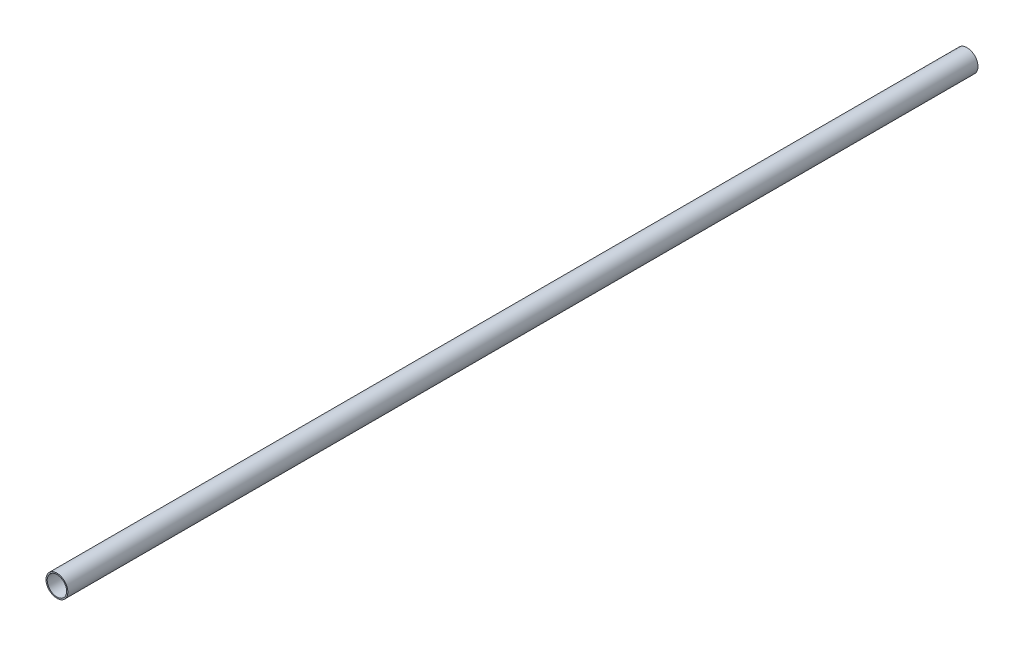
ISO-10303-21;
HEADER;
FILE_DESCRIPTION(('STEP AP214'),'2;1');
FILE_NAME('part.step','',(''),(''),'','','');
FILE_SCHEMA(('AUTOMOTIVE_DESIGN { 1 0 10303 214 1 1 1 1 }'));
ENDSEC;
DATA;
#1=APPLICATION_CONTEXT('core data for automotive mechanical design processes');
#2=APPLICATION_PROTOCOL_DEFINITION('international standard','automotive_design',2000,#1);
#3=PRODUCT_CONTEXT('',#1,'mechanical');
#4=PRODUCT('Part','Part','',(#3));
#5=PRODUCT_RELATED_PRODUCT_CATEGORY('part','',(#4));
#6=PRODUCT_DEFINITION_FORMATION('','',#4);
#7=PRODUCT_DEFINITION_CONTEXT('part definition',#1,'design');
#8=PRODUCT_DEFINITION('design','',#6,#7);
#9=PRODUCT_DEFINITION_SHAPE('','',#8);
#10=(LENGTH_UNIT() NAMED_UNIT(*) SI_UNIT(.MILLI.,.METRE.));
#11=(NAMED_UNIT(*) PLANE_ANGLE_UNIT() SI_UNIT($,.RADIAN.));
#12=(NAMED_UNIT(*) SI_UNIT($,.STERADIAN.) SOLID_ANGLE_UNIT());
#13=UNCERTAINTY_MEASURE_WITH_UNIT(LENGTH_MEASURE(1.E-05),#10,'distance_accuracy_value','');
#14=(GEOMETRIC_REPRESENTATION_CONTEXT(3) GLOBAL_UNCERTAINTY_ASSIGNED_CONTEXT((#13)) GLOBAL_UNIT_ASSIGNED_CONTEXT((#10,
#11,#12)) REPRESENTATION_CONTEXT('',''));
#15=CARTESIAN_POINT('',(0.,0.,0.));
#16=DIRECTION('',(0.,0.,1.));
#17=DIRECTION('',(1.,0.,0.));
#18=AXIS2_PLACEMENT_3D('',#15,#16,#17);
#19=CARTESIAN_POINT('',(0.,0.,330.2));
#20=DIRECTION('',(0.,0.,1.));
#21=DIRECTION('',(1.,0.,0.));
#22=AXIS2_PLACEMENT_3D('',#19,#20,#21);
#23=PLANE('',#22);
#24=CARTESIAN_POINT('',(0.,0.,330.2));
#25=DIRECTION('',(0.,0.,1.));
#26=DIRECTION('',(1.,0.,0.));
#27=AXIS2_PLACEMENT_3D('',#24,#25,#26);
#28=CIRCLE('',#27,7.9375);
#29=CARTESIAN_POINT('',(7.9375,0.,330.2));
#30=VERTEX_POINT('',#29);
#31=EDGE_CURVE('E10',#30,#30,#28,.T.);
#32=ORIENTED_EDGE('',*,*,#31,.T.);
#33=EDGE_LOOP('',(#32));
#34=FACE_BOUND('',#33,.T.);
#35=CARTESIAN_POINT('',(0.,0.,330.2));
#36=DIRECTION('',(0.,0.,1.));
#37=DIRECTION('',(1.,0.,0.));
#38=AXIS2_PLACEMENT_3D('',#35,#36,#37);
#39=CIRCLE('',#38,7.0485);
#40=CARTESIAN_POINT('',(7.0485,0.,330.2));
#41=VERTEX_POINT('',#40);
#42=EDGE_CURVE('E54',#41,#41,#39,.T.);
#43=ORIENTED_EDGE('',*,*,#42,.F.);
#44=EDGE_LOOP('',(#43));
#45=FACE_BOUND('',#44,.T.);
#46=ADVANCED_FACE('F41',(#34,#45),#23,.T.);
#47=CARTESIAN_POINT('',(0.,0.,-330.2));
#48=DIRECTION('',(0.,0.,1.));
#49=DIRECTION('',(1.,0.,0.));
#50=AXIS2_PLACEMENT_3D('',#47,#48,#49);
#51=PLANE('',#50);
#52=CARTESIAN_POINT('',(0.,0.,-330.2));
#53=DIRECTION('',(0.,0.,1.));
#54=DIRECTION('',(1.,0.,0.));
#55=AXIS2_PLACEMENT_3D('',#52,#53,#54);
#56=CIRCLE('',#55,7.9375);
#57=CARTESIAN_POINT('',(7.9375,0.,-330.2));
#58=VERTEX_POINT('',#57);
#59=EDGE_CURVE('E45',#58,#58,#56,.T.);
#60=ORIENTED_EDGE('',*,*,#59,.F.);
#61=EDGE_LOOP('',(#60));
#62=FACE_BOUND('',#61,.T.);
#63=CARTESIAN_POINT('',(0.,0.,-330.2));
#64=DIRECTION('',(0.,0.,1.));
#65=DIRECTION('',(1.,0.,0.));
#66=AXIS2_PLACEMENT_3D('',#63,#64,#65);
#67=CIRCLE('',#66,7.0485);
#68=CARTESIAN_POINT('',(7.0485,0.,-330.2));
#69=VERTEX_POINT('',#68);
#70=EDGE_CURVE('E56',#69,#69,#67,.T.);
#71=ORIENTED_EDGE('',*,*,#70,.T.);
#72=EDGE_LOOP('',(#71));
#73=FACE_BOUND('',#72,.T.);
#74=ADVANCED_FACE('F68',(#62,#73),#51,.F.);
#75=CARTESIAN_POINT('',(0.,0.,330.2));
#76=DIRECTION('',(0.,0.,-1.));
#77=DIRECTION('',(-1.,0.,0.));
#78=AXIS2_PLACEMENT_3D('',#75,#76,#77);
#79=CYLINDRICAL_SURFACE('',#78,7.9375);
#80=ORIENTED_EDGE('',*,*,#31,.F.);
#81=EDGE_LOOP('',(#80));
#82=FACE_BOUND('',#81,.T.);
#83=ORIENTED_EDGE('',*,*,#59,.T.);
#84=EDGE_LOOP('',(#83));
#85=FACE_BOUND('',#84,.T.);
#86=ADVANCED_FACE('F43',(#82,#85),#79,.T.);
#87=CARTESIAN_POINT('',(0.,0.,330.2));
#88=DIRECTION('',(0.,0.,-1.));
#89=DIRECTION('',(-1.,0.,0.));
#90=AXIS2_PLACEMENT_3D('',#87,#88,#89);
#91=CYLINDRICAL_SURFACE('',#90,7.0485);
#92=ORIENTED_EDGE('',*,*,#42,.T.);
#93=EDGE_LOOP('',(#92));
#94=FACE_BOUND('',#93,.T.);
#95=ORIENTED_EDGE('',*,*,#70,.F.);
#96=EDGE_LOOP('',(#95));
#97=FACE_BOUND('',#96,.T.);
#98=ADVANCED_FACE('F64',(#94,#97),#91,.F.);
#99=CLOSED_SHELL('',(#46,#74,#86,#98));
#100=MANIFOLD_SOLID_BREP('B2',#99);
#101=ADVANCED_BREP_SHAPE_REPRESENTATION('',(#18,#100),#14);
#102=SHAPE_DEFINITION_REPRESENTATION(#9,#101);
ENDSEC;
END-ISO-10303-21;
